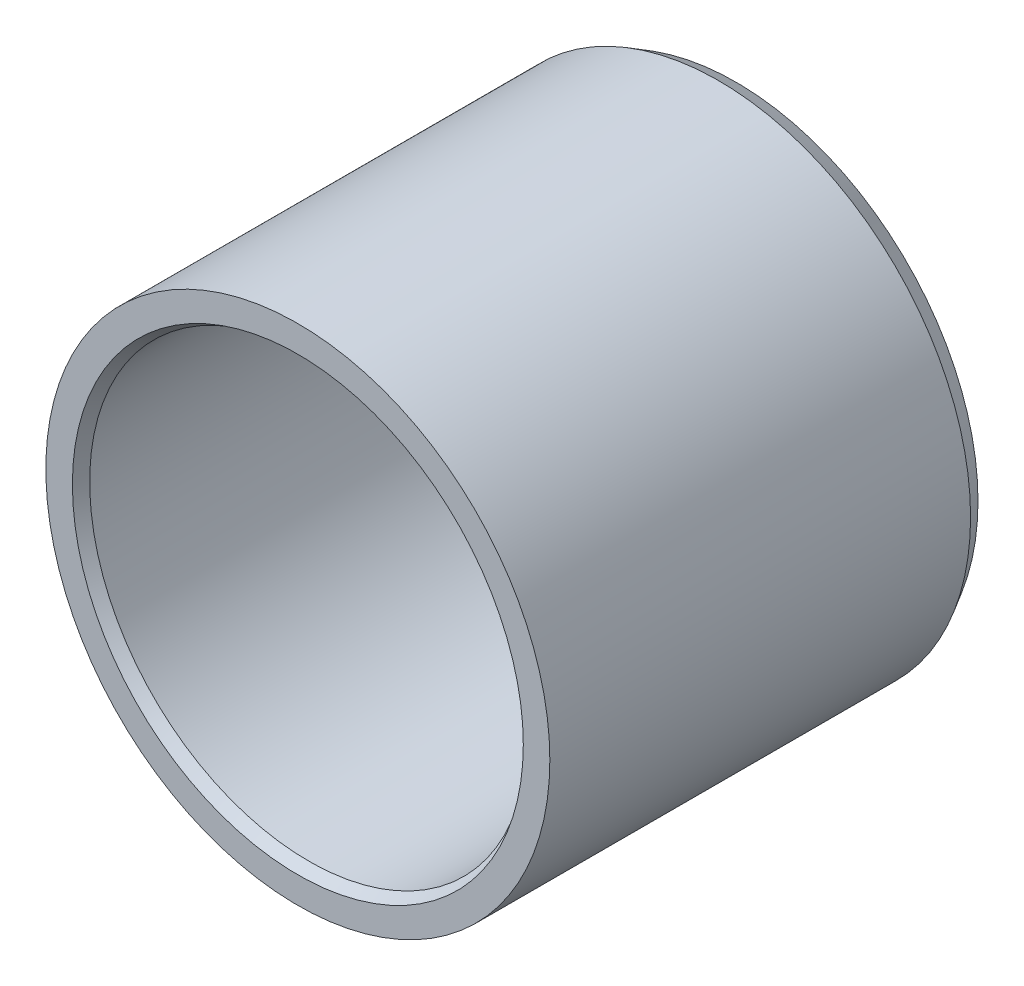
ISO-10303-21;
HEADER;
FILE_DESCRIPTION(('STEP AP214'),'2;1');
FILE_NAME('part.step','',(''),(''),'','','');
FILE_SCHEMA(('AUTOMOTIVE_DESIGN { 1 0 10303 214 1 1 1 1 }'));
ENDSEC;
DATA;
#1=APPLICATION_CONTEXT('core data for automotive mechanical design processes');
#2=APPLICATION_PROTOCOL_DEFINITION('international standard','automotive_design',2000,#1);
#3=PRODUCT_CONTEXT('',#1,'mechanical');
#4=PRODUCT('Part','Part','',(#3));
#5=PRODUCT_RELATED_PRODUCT_CATEGORY('part','',(#4));
#6=PRODUCT_DEFINITION_FORMATION('','',#4);
#7=PRODUCT_DEFINITION_CONTEXT('part definition',#1,'design');
#8=PRODUCT_DEFINITION('design','',#6,#7);
#9=PRODUCT_DEFINITION_SHAPE('','',#8);
#10=(LENGTH_UNIT() NAMED_UNIT(*) SI_UNIT(.MILLI.,.METRE.));
#11=(NAMED_UNIT(*) PLANE_ANGLE_UNIT() SI_UNIT($,.RADIAN.));
#12=(NAMED_UNIT(*) SI_UNIT($,.STERADIAN.) SOLID_ANGLE_UNIT());
#13=UNCERTAINTY_MEASURE_WITH_UNIT(LENGTH_MEASURE(1.E-05),#10,'distance_accuracy_value','');
#14=(GEOMETRIC_REPRESENTATION_CONTEXT(3) GLOBAL_UNCERTAINTY_ASSIGNED_CONTEXT((#13)) GLOBAL_UNIT_ASSIGNED_CONTEXT((#10,
#11,#12)) REPRESENTATION_CONTEXT('',''));
#15=CARTESIAN_POINT('',(0.,0.,0.));
#16=DIRECTION('',(0.,0.,1.));
#17=DIRECTION('',(1.,0.,0.));
#18=AXIS2_PLACEMENT_3D('',#15,#16,#17);
#19=CARTESIAN_POINT('',(0.,0.,20.));
#20=DIRECTION('',(0.,0.,1.));
#21=DIRECTION('',(1.,0.,0.));
#22=AXIS2_PLACEMENT_3D('',#19,#20,#21);
#23=PLANE('',#22);
#24=CARTESIAN_POINT('',(0.,0.,20.));
#25=DIRECTION('',(0.,0.,1.));
#26=DIRECTION('',(1.,0.,0.));
#27=AXIS2_PLACEMENT_3D('',#24,#25,#26);
#28=CIRCLE('',#27,10.2886751345948);
#29=CARTESIAN_POINT('',(10.2886751345948,0.,20.));
#30=VERTEX_POINT('',#29);
#31=EDGE_CURVE('E37',#30,#30,#28,.F.);
#32=ORIENTED_EDGE('',*,*,#31,.T.);
#33=EDGE_LOOP('',(#32));
#34=FACE_BOUND('',#33,.T.);
#35=CARTESIAN_POINT('',(0.,0.,20.));
#36=DIRECTION('',(0.,0.,1.));
#37=DIRECTION('',(1.,0.,0.));
#38=AXIS2_PLACEMENT_3D('',#35,#36,#37);
#39=CIRCLE('',#38,11.5);
#40=CARTESIAN_POINT('',(11.5,0.,20.));
#41=VERTEX_POINT('',#40);
#42=EDGE_CURVE('E46',#41,#41,#39,.T.);
#43=ORIENTED_EDGE('',*,*,#42,.T.);
#44=EDGE_LOOP('',(#43));
#45=FACE_BOUND('',#44,.T.);
#46=ADVANCED_FACE('F26',(#34,#45),#23,.T.);
#47=CARTESIAN_POINT('',(0.,0.,0.));
#48=DIRECTION('',(0.,0.,1.));
#49=DIRECTION('',(1.,0.,0.));
#50=AXIS2_PLACEMENT_3D('',#47,#48,#49);
#51=PLANE('',#50);
#52=CARTESIAN_POINT('',(0.,0.,0.));
#53=DIRECTION('',(0.,0.,1.));
#54=DIRECTION('',(1.,0.,0.));
#55=AXIS2_PLACEMENT_3D('',#52,#53,#54);
#56=CIRCLE('',#55,11.0381197846483);
#57=CARTESIAN_POINT('',(11.0381197846483,0.,0.));
#58=VERTEX_POINT('',#57);
#59=EDGE_CURVE('E10',#58,#58,#56,.F.);
#60=ORIENTED_EDGE('',*,*,#59,.T.);
#61=EDGE_LOOP('',(#60));
#62=FACE_BOUND('',#61,.T.);
#63=CARTESIAN_POINT('',(0.,0.,0.));
#64=DIRECTION('',(0.,0.,1.));
#65=DIRECTION('',(1.,0.,0.));
#66=AXIS2_PLACEMENT_3D('',#63,#64,#65);
#67=CIRCLE('',#66,10.);
#68=CARTESIAN_POINT('',(10.,0.,0.));
#69=VERTEX_POINT('',#68);
#70=EDGE_CURVE('E49',#69,#69,#67,.T.);
#71=ORIENTED_EDGE('',*,*,#70,.T.);
#72=EDGE_LOOP('',(#71));
#73=FACE_BOUND('',#72,.T.);
#74=ADVANCED_FACE('F53',(#62,#73),#51,.F.);
#75=CARTESIAN_POINT('',(0.,0.,20.));
#76=DIRECTION('',(0.,0.,-1.));
#77=DIRECTION('',(-1.,0.,0.));
#78=AXIS2_PLACEMENT_3D('',#75,#76,#77);
#79=CYLINDRICAL_SURFACE('',#78,11.5);
#80=CARTESIAN_POINT('',(0.,0.,0.800000000000006));
#81=DIRECTION('',(0.,0.,1.));
#82=DIRECTION('',(1.,0.,0.));
#83=AXIS2_PLACEMENT_3D('',#80,#81,#82);
#84=CIRCLE('',#83,11.5);
#85=CARTESIAN_POINT('',(11.5,0.,0.800000000000006));
#86=VERTEX_POINT('',#85);
#87=EDGE_CURVE('E33',#86,#86,#84,.T.);
#88=ORIENTED_EDGE('',*,*,#87,.T.);
#89=EDGE_LOOP('',(#88));
#90=FACE_BOUND('',#89,.T.);
#91=ORIENTED_EDGE('',*,*,#42,.F.);
#92=EDGE_LOOP('',(#91));
#93=FACE_BOUND('',#92,.T.);
#94=ADVANCED_FACE('F28',(#90,#93),#79,.T.);
#95=CARTESIAN_POINT('',(0.,0.,20.));
#96=DIRECTION('',(0.,0.,-1.));
#97=DIRECTION('',(-1.,0.,0.));
#98=AXIS2_PLACEMENT_3D('',#95,#96,#97);
#99=CYLINDRICAL_SURFACE('',#98,10.);
#100=CARTESIAN_POINT('',(0.,0.,19.5));
#101=DIRECTION('',(0.,0.,1.));
#102=DIRECTION('',(1.,0.,0.));
#103=AXIS2_PLACEMENT_3D('',#100,#101,#102);
#104=CIRCLE('',#103,10.);
#105=CARTESIAN_POINT('',(10.,0.,19.5));
#106=VERTEX_POINT('',#105);
#107=EDGE_CURVE('E41',#106,#106,#104,.T.);
#108=ORIENTED_EDGE('',*,*,#107,.T.);
#109=EDGE_LOOP('',(#108));
#110=FACE_BOUND('',#109,.T.);
#111=ORIENTED_EDGE('',*,*,#70,.F.);
#112=EDGE_LOOP('',(#111));
#113=FACE_BOUND('',#112,.T.);
#114=ADVANCED_FACE('F55',(#110,#113),#99,.F.);
#115=CARTESIAN_POINT('',(0.,0.,19.5));
#116=DIRECTION('',(0.,0.,1.));
#117=DIRECTION('',(1.,0.,0.));
#118=AXIS2_PLACEMENT_3D('',#115,#116,#117);
#119=CONICAL_SURFACE('',#118,10.,0.523598775598297);
#120=ORIENTED_EDGE('',*,*,#31,.F.);
#121=EDGE_LOOP('',(#120));
#122=FACE_BOUND('',#121,.T.);
#123=ORIENTED_EDGE('',*,*,#107,.F.);
#124=EDGE_LOOP('',(#123));
#125=FACE_BOUND('',#124,.T.);
#126=ADVANCED_FACE('F57',(#122,#125),#119,.F.);
#127=CARTESIAN_POINT('',(0.,0.,0.800000000000006));
#128=DIRECTION('',(0.,0.,1.));
#129=DIRECTION('',(1.,0.,0.));
#130=AXIS2_PLACEMENT_3D('',#127,#128,#129);
#131=CONICAL_SURFACE('',#130,11.5,0.523598775598295);
#132=ORIENTED_EDGE('',*,*,#59,.F.);
#133=EDGE_LOOP('',(#132));
#134=FACE_BOUND('',#133,.T.);
#135=ORIENTED_EDGE('',*,*,#87,.F.);
#136=EDGE_LOOP('',(#135));
#137=FACE_BOUND('',#136,.T.);
#138=ADVANCED_FACE('F64',(#134,#137),#131,.T.);
#139=CLOSED_SHELL('',(#46,#74,#94,#114,#126,#138));
#140=MANIFOLD_SOLID_BREP('B2',#139);
#141=ADVANCED_BREP_SHAPE_REPRESENTATION('',(#18,#140),#14);
#142=SHAPE_DEFINITION_REPRESENTATION(#9,#141);
ENDSEC;
END-ISO-10303-21;
